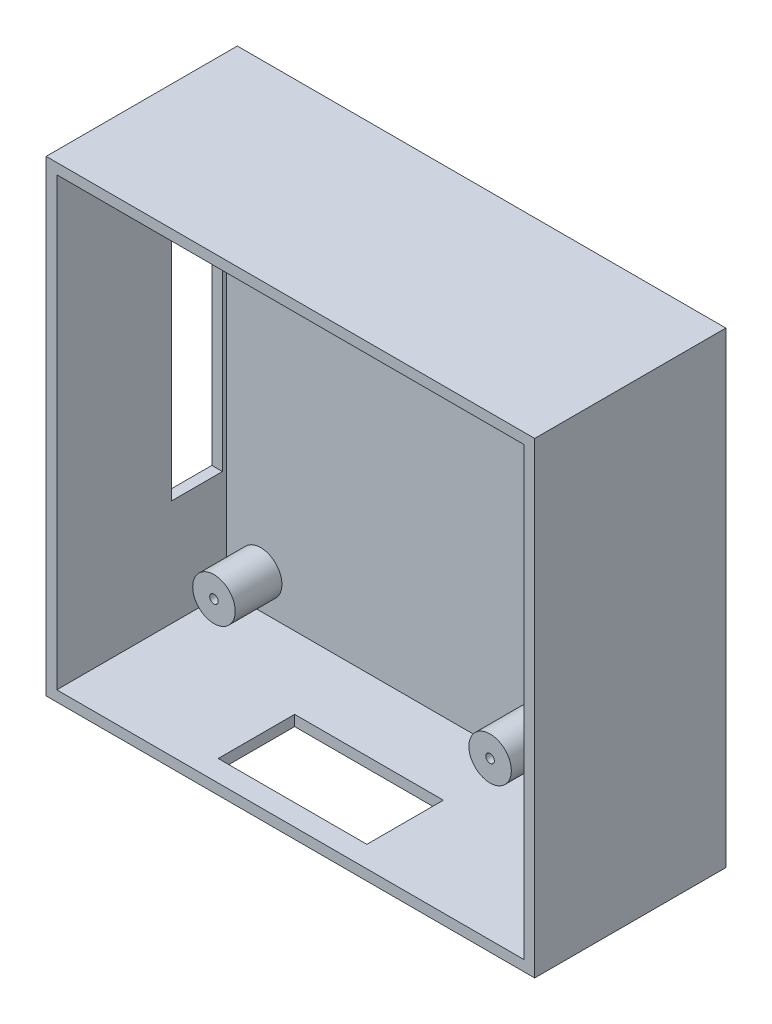
ISO-10303-21;
HEADER;
FILE_DESCRIPTION(('STEP AP214'),'2;1');
FILE_NAME('part.step','',(''),(''),'','','');
FILE_SCHEMA(('AUTOMOTIVE_DESIGN { 1 0 10303 214 1 1 1 1 }'));
ENDSEC;
DATA;
#1=APPLICATION_CONTEXT('core data for automotive mechanical design processes');
#2=APPLICATION_PROTOCOL_DEFINITION('international standard','automotive_design',2000,#1);
#3=PRODUCT_CONTEXT('',#1,'mechanical');
#4=PRODUCT('Part','Part','',(#3));
#5=PRODUCT_RELATED_PRODUCT_CATEGORY('part','',(#4));
#6=PRODUCT_DEFINITION_FORMATION('','',#4);
#7=PRODUCT_DEFINITION_CONTEXT('part definition',#1,'design');
#8=PRODUCT_DEFINITION('design','',#6,#7);
#9=PRODUCT_DEFINITION_SHAPE('','',#8);
#10=(LENGTH_UNIT() NAMED_UNIT(*) SI_UNIT(.MILLI.,.METRE.));
#11=(NAMED_UNIT(*) PLANE_ANGLE_UNIT() SI_UNIT($,.RADIAN.));
#12=(NAMED_UNIT(*) SI_UNIT($,.STERADIAN.) SOLID_ANGLE_UNIT());
#13=UNCERTAINTY_MEASURE_WITH_UNIT(LENGTH_MEASURE(1.E-05),#10,'distance_accuracy_value','');
#14=(GEOMETRIC_REPRESENTATION_CONTEXT(3) GLOBAL_UNCERTAINTY_ASSIGNED_CONTEXT((#13)) GLOBAL_UNIT_ASSIGNED_CONTEXT((#10,
#11,#12)) REPRESENTATION_CONTEXT('',''));
#15=CARTESIAN_POINT('',(0.,0.,0.));
#16=DIRECTION('',(0.,0.,1.));
#17=DIRECTION('',(1.,0.,0.));
#18=AXIS2_PLACEMENT_3D('',#15,#16,#17);
#19=CARTESIAN_POINT('',(57.5,55.,45.));
#20=DIRECTION('',(-1.,0.,0.));
#21=DIRECTION('',(0.,-1.,0.));
#22=AXIS2_PLACEMENT_3D('',#19,#20,#21);
#23=PLANE('',#22);
#24=DIRECTION('',(0.,1.,0.));
#25=VECTOR('',#24,1.);
#26=CARTESIAN_POINT('',(57.5,55.,0.));
#27=LINE('',#26,#25);
#28=CARTESIAN_POINT('',(57.5,-55.,0.));
#29=VERTEX_POINT('',#28);
#30=CARTESIAN_POINT('',(57.5,55.,0.));
#31=VERTEX_POINT('',#30);
#32=EDGE_CURVE('E315',#29,#31,#27,.T.);
#33=ORIENTED_EDGE('',*,*,#32,.T.);
#34=DIRECTION('',(0.,0.,-1.));
#35=VECTOR('',#34,1.);
#36=CARTESIAN_POINT('',(57.5,55.,45.));
#37=LINE('',#36,#35);
#38=CARTESIAN_POINT('',(57.5,55.,45.));
#39=VERTEX_POINT('',#38);
#40=EDGE_CURVE('E362',#39,#31,#37,.T.);
#41=ORIENTED_EDGE('',*,*,#40,.F.);
#42=DIRECTION('',(0.,1.,0.));
#43=VECTOR('',#42,1.);
#44=CARTESIAN_POINT('',(57.5,55.,45.));
#45=LINE('',#44,#43);
#46=CARTESIAN_POINT('',(57.5,-55.,45.));
#47=VERTEX_POINT('',#46);
#48=EDGE_CURVE('E325',#47,#39,#45,.T.);
#49=ORIENTED_EDGE('',*,*,#48,.F.);
#50=DIRECTION('',(0.,0.,-1.));
#51=VECTOR('',#50,1.);
#52=CARTESIAN_POINT('',(57.5,-55.,45.));
#53=LINE('',#52,#51);
#54=EDGE_CURVE('E339',#47,#29,#53,.T.);
#55=ORIENTED_EDGE('',*,*,#54,.T.);
#56=EDGE_LOOP('',(#33,#41,#49,#55));
#57=FACE_BOUND('',#56,.T.);
#58=ADVANCED_FACE('F41',(#57),#23,.F.);
#59=CARTESIAN_POINT('',(-57.5,55.,45.));
#60=DIRECTION('',(0.,-1.,0.));
#61=DIRECTION('',(0.,0.,-1.));
#62=AXIS2_PLACEMENT_3D('',#59,#60,#61);
#63=PLANE('',#62);
#64=DIRECTION('',(-1.,0.,0.));
#65=VECTOR('',#64,1.);
#66=CARTESIAN_POINT('',(-57.5,55.,0.));
#67=LINE('',#66,#65);
#68=CARTESIAN_POINT('',(-57.5,55.,0.));
#69=VERTEX_POINT('',#68);
#70=EDGE_CURVE('E343',#31,#69,#67,.T.);
#71=ORIENTED_EDGE('',*,*,#70,.T.);
#72=DIRECTION('',(0.,0.,-1.));
#73=VECTOR('',#72,1.);
#74=CARTESIAN_POINT('',(-57.5,55.,45.));
#75=LINE('',#74,#73);
#76=CARTESIAN_POINT('',(-57.5,55.,45.));
#77=VERTEX_POINT('',#76);
#78=EDGE_CURVE('E358',#77,#69,#75,.T.);
#79=ORIENTED_EDGE('',*,*,#78,.F.);
#80=DIRECTION('',(-1.,0.,0.));
#81=VECTOR('',#80,1.);
#82=CARTESIAN_POINT('',(-57.5,55.,45.));
#83=LINE('',#82,#81);
#84=EDGE_CURVE('E329',#39,#77,#83,.T.);
#85=ORIENTED_EDGE('',*,*,#84,.F.);
#86=ORIENTED_EDGE('',*,*,#40,.T.);
#87=EDGE_LOOP('',(#71,#79,#85,#86));
#88=FACE_BOUND('',#87,.T.);
#89=ADVANCED_FACE('F408',(#88),#63,.F.);
#90=CARTESIAN_POINT('',(-57.5,55.,45.));
#91=DIRECTION('',(1.,0.,0.));
#92=DIRECTION('',(0.,1.,0.));
#93=AXIS2_PLACEMENT_3D('',#90,#91,#92);
#94=PLANE('',#93);
#95=DIRECTION('',(0.,0.,1.));
#96=VECTOR('',#95,1.);
#97=CARTESIAN_POINT('',(-57.5,-27.5,6.00000000000001));
#98=LINE('',#97,#96);
#99=CARTESIAN_POINT('',(-57.5,-27.5,6.00000000000001));
#100=VERTEX_POINT('',#99);
#101=CARTESIAN_POINT('',(-57.5,-27.5,18.));
#102=VERTEX_POINT('',#101);
#103=EDGE_CURVE('E167',#100,#102,#98,.T.);
#104=ORIENTED_EDGE('',*,*,#103,.F.);
#105=DIRECTION('',(0.,-1.,0.));
#106=VECTOR('',#105,1.);
#107=CARTESIAN_POINT('',(-57.5,32.5,6.));
#108=LINE('',#107,#106);
#109=CARTESIAN_POINT('',(-57.5,32.5,6.));
#110=VERTEX_POINT('',#109);
#111=EDGE_CURVE('E56',#110,#100,#108,.T.);
#112=ORIENTED_EDGE('',*,*,#111,.F.);
#113=DIRECTION('',(0.,0.,-1.));
#114=VECTOR('',#113,1.);
#115=CARTESIAN_POINT('',(-57.5,32.5,6.));
#116=LINE('',#115,#114);
#117=CARTESIAN_POINT('',(-57.5,32.5,18.));
#118=VERTEX_POINT('',#117);
#119=EDGE_CURVE('E175',#118,#110,#116,.T.);
#120=ORIENTED_EDGE('',*,*,#119,.F.);
#121=DIRECTION('',(0.,1.,0.));
#122=VECTOR('',#121,1.);
#123=CARTESIAN_POINT('',(-57.5,32.5,18.));
#124=LINE('',#123,#122);
#125=EDGE_CURVE('E157',#102,#118,#124,.T.);
#126=ORIENTED_EDGE('',*,*,#125,.F.);
#127=EDGE_LOOP('',(#104,#112,#120,#126));
#128=FACE_BOUND('',#127,.T.);
#129=DIRECTION('',(0.,-1.,0.));
#130=VECTOR('',#129,1.);
#131=CARTESIAN_POINT('',(-57.5,55.,0.));
#132=LINE('',#131,#130);
#133=CARTESIAN_POINT('',(-57.5,-55.,0.));
#134=VERTEX_POINT('',#133);
#135=EDGE_CURVE('E346',#69,#134,#132,.T.);
#136=ORIENTED_EDGE('',*,*,#135,.T.);
#137=DIRECTION('',(0.,0.,-1.));
#138=VECTOR('',#137,1.);
#139=CARTESIAN_POINT('',(-57.5,-55.,45.));
#140=LINE('',#139,#138);
#141=CARTESIAN_POINT('',(-57.5,-55.,45.));
#142=VERTEX_POINT('',#141);
#143=EDGE_CURVE('E354',#142,#134,#140,.T.);
#144=ORIENTED_EDGE('',*,*,#143,.F.);
#145=DIRECTION('',(0.,-1.,0.));
#146=VECTOR('',#145,1.);
#147=CARTESIAN_POINT('',(-57.5,55.,45.));
#148=LINE('',#147,#146);
#149=EDGE_CURVE('E333',#77,#142,#148,.T.);
#150=ORIENTED_EDGE('',*,*,#149,.F.);
#151=ORIENTED_EDGE('',*,*,#78,.T.);
#152=EDGE_LOOP('',(#136,#144,#150,#151));
#153=FACE_BOUND('',#152,.T.);
#154=ADVANCED_FACE('F172',(#128,#153),#94,.F.);
#155=CARTESIAN_POINT('',(-57.5,-55.,45.));
#156=DIRECTION('',(0.,1.,0.));
#157=DIRECTION('',(0.,0.,1.));
#158=AXIS2_PLACEMENT_3D('',#155,#156,#157);
#159=PLANE('',#158);
#160=DIRECTION('',(0.,0.,1.));
#161=VECTOR('',#160,1.);
#162=CARTESIAN_POINT('',(13.,-55.,40.));
#163=LINE('',#162,#161);
#164=CARTESIAN_POINT('',(13.,-55.,22.));
#165=VERTEX_POINT('',#164);
#166=CARTESIAN_POINT('',(13.,-55.,40.));
#167=VERTEX_POINT('',#166);
#168=EDGE_CURVE('E197',#165,#167,#163,.T.);
#169=ORIENTED_EDGE('',*,*,#168,.F.);
#170=DIRECTION('',(1.,0.,0.));
#171=VECTOR('',#170,1.);
#172=CARTESIAN_POINT('',(-22.,-55.,22.));
#173=LINE('',#172,#171);
#174=CARTESIAN_POINT('',(-22.,-55.,22.));
#175=VERTEX_POINT('',#174);
#176=EDGE_CURVE('E201',#175,#165,#173,.T.);
#177=ORIENTED_EDGE('',*,*,#176,.F.);
#178=DIRECTION('',(0.,0.,-1.));
#179=VECTOR('',#178,1.);
#180=CARTESIAN_POINT('',(-22.,-55.,40.));
#181=LINE('',#180,#179);
#182=CARTESIAN_POINT('',(-22.,-55.,40.));
#183=VERTEX_POINT('',#182);
#184=EDGE_CURVE('E205',#183,#175,#181,.T.);
#185=ORIENTED_EDGE('',*,*,#184,.F.);
#186=DIRECTION('',(-1.,0.,0.));
#187=VECTOR('',#186,1.);
#188=CARTESIAN_POINT('',(-22.,-55.,40.));
#189=LINE('',#188,#187);
#190=EDGE_CURVE('E193',#167,#183,#189,.T.);
#191=ORIENTED_EDGE('',*,*,#190,.F.);
#192=EDGE_LOOP('',(#169,#177,#185,#191));
#193=FACE_BOUND('',#192,.T.);
#194=DIRECTION('',(1.,0.,0.));
#195=VECTOR('',#194,1.);
#196=CARTESIAN_POINT('',(-57.5,-55.,0.));
#197=LINE('',#196,#195);
#198=EDGE_CURVE('E330',#134,#29,#197,.T.);
#199=ORIENTED_EDGE('',*,*,#198,.T.);
#200=ORIENTED_EDGE('',*,*,#54,.F.);
#201=DIRECTION('',(1.,0.,0.));
#202=VECTOR('',#201,1.);
#203=CARTESIAN_POINT('',(-57.5,-55.,45.));
#204=LINE('',#203,#202);
#205=EDGE_CURVE('E336',#142,#47,#204,.T.);
#206=ORIENTED_EDGE('',*,*,#205,.F.);
#207=ORIENTED_EDGE('',*,*,#143,.T.);
#208=EDGE_LOOP('',(#199,#200,#206,#207));
#209=FACE_BOUND('',#208,.T.);
#210=ADVANCED_FACE('F429',(#193,#209),#159,.F.);
#211=CARTESIAN_POINT('',(0.,0.,45.));
#212=DIRECTION('',(0.,0.,1.));
#213=DIRECTION('',(1.,0.,0.));
#214=AXIS2_PLACEMENT_3D('',#211,#212,#213);
#215=PLANE('',#214);
#216=DIRECTION('',(0.,-1.,0.));
#217=VECTOR('',#216,1.);
#218=CARTESIAN_POINT('',(-55.,52.5,45.));
#219=LINE('',#218,#217);
#220=CARTESIAN_POINT('',(-55.,52.5,45.));
#221=VERTEX_POINT('',#220);
#222=CARTESIAN_POINT('',(-55.,-52.5,45.));
#223=VERTEX_POINT('',#222);
#224=EDGE_CURVE('E280',#221,#223,#219,.T.);
#225=ORIENTED_EDGE('',*,*,#224,.F.);
#226=DIRECTION('',(-1.,0.,0.));
#227=VECTOR('',#226,1.);
#228=CARTESIAN_POINT('',(55.,52.5,45.));
#229=LINE('',#228,#227);
#230=CARTESIAN_POINT('',(55.,52.5,45.));
#231=VERTEX_POINT('',#230);
#232=EDGE_CURVE('E286',#231,#221,#229,.T.);
#233=ORIENTED_EDGE('',*,*,#232,.F.);
#234=DIRECTION('',(0.,1.,0.));
#235=VECTOR('',#234,1.);
#236=CARTESIAN_POINT('',(55.,52.5,45.));
#237=LINE('',#236,#235);
#238=CARTESIAN_POINT('',(55.,-52.5,45.));
#239=VERTEX_POINT('',#238);
#240=EDGE_CURVE('E305',#239,#231,#237,.T.);
#241=ORIENTED_EDGE('',*,*,#240,.F.);
#242=DIRECTION('',(1.,0.,0.));
#243=VECTOR('',#242,1.);
#244=CARTESIAN_POINT('',(55.,-52.5,45.));
#245=LINE('',#244,#243);
#246=EDGE_CURVE('E301',#223,#239,#245,.T.);
#247=ORIENTED_EDGE('',*,*,#246,.F.);
#248=EDGE_LOOP('',(#225,#233,#241,#247));
#249=FACE_BOUND('',#248,.T.);
#250=ORIENTED_EDGE('',*,*,#48,.T.);
#251=ORIENTED_EDGE('',*,*,#84,.T.);
#252=ORIENTED_EDGE('',*,*,#149,.T.);
#253=ORIENTED_EDGE('',*,*,#205,.T.);
#254=EDGE_LOOP('',(#250,#251,#252,#253));
#255=FACE_BOUND('',#254,.T.);
#256=ADVANCED_FACE('F425',(#249,#255),#215,.T.);
#257=CARTESIAN_POINT('',(0.,0.,0.));
#258=DIRECTION('',(0.,0.,1.));
#259=DIRECTION('',(1.,0.,0.));
#260=AXIS2_PLACEMENT_3D('',#257,#258,#259);
#261=PLANE('',#260);
#262=CARTESIAN_POINT('',(-47.,-44.5,0.));
#263=DIRECTION('',(0.,0.,1.));
#264=DIRECTION('',(1.,0.,0.));
#265=AXIS2_PLACEMENT_3D('',#262,#263,#264);
#266=CIRCLE('',#265,0.999999999999998);
#267=CARTESIAN_POINT('',(-46.,-44.5,0.));
#268=VERTEX_POINT('',#267);
#269=EDGE_CURVE('E250',#268,#268,#266,.T.);
#270=ORIENTED_EDGE('',*,*,#269,.T.);
#271=EDGE_LOOP('',(#270));
#272=FACE_BOUND('',#271,.T.);
#273=CARTESIAN_POINT('',(18.,-44.5,0.));
#274=DIRECTION('',(0.,0.,1.));
#275=DIRECTION('',(1.,0.,0.));
#276=AXIS2_PLACEMENT_3D('',#273,#274,#275);
#277=CIRCLE('',#276,1.);
#278=CARTESIAN_POINT('',(19.,-44.5,0.));
#279=VERTEX_POINT('',#278);
#280=EDGE_CURVE('E242',#279,#279,#277,.T.);
#281=ORIENTED_EDGE('',*,*,#280,.T.);
#282=EDGE_LOOP('',(#281));
#283=FACE_BOUND('',#282,.T.);
#284=CARTESIAN_POINT('',(18.,44.5,0.));
#285=DIRECTION('',(0.,0.,1.));
#286=DIRECTION('',(1.,0.,0.));
#287=AXIS2_PLACEMENT_3D('',#284,#285,#286);
#288=CIRCLE('',#287,1.);
#289=CARTESIAN_POINT('',(19.,44.5,0.));
#290=VERTEX_POINT('',#289);
#291=EDGE_CURVE('E233',#290,#290,#288,.T.);
#292=ORIENTED_EDGE('',*,*,#291,.T.);
#293=EDGE_LOOP('',(#292));
#294=FACE_BOUND('',#293,.T.);
#295=CARTESIAN_POINT('',(-47.,44.5,0.));
#296=DIRECTION('',(0.,0.,1.));
#297=DIRECTION('',(1.,0.,0.));
#298=AXIS2_PLACEMENT_3D('',#295,#296,#297);
#299=CIRCLE('',#298,0.999999999999998);
#300=CARTESIAN_POINT('',(-46.,44.5,0.));
#301=VERTEX_POINT('',#300);
#302=EDGE_CURVE('E257',#301,#301,#299,.T.);
#303=ORIENTED_EDGE('',*,*,#302,.T.);
#304=EDGE_LOOP('',(#303));
#305=FACE_BOUND('',#304,.T.);
#306=ORIENTED_EDGE('',*,*,#32,.F.);
#307=ORIENTED_EDGE('',*,*,#198,.F.);
#308=ORIENTED_EDGE('',*,*,#135,.F.);
#309=ORIENTED_EDGE('',*,*,#70,.F.);
#310=EDGE_LOOP('',(#306,#307,#308,#309));
#311=FACE_BOUND('',#310,.T.);
#312=ADVANCED_FACE('F420',(#272,#283,#294,#305,#311),#261,.F.);
#313=CARTESIAN_POINT('',(-55.,52.5,5.));
#314=DIRECTION('',(-1.,0.,0.));
#315=DIRECTION('',(0.,-1.,0.));
#316=AXIS2_PLACEMENT_3D('',#313,#314,#315);
#317=PLANE('',#316);
#318=DIRECTION('',(0.,0.,-1.));
#319=VECTOR('',#318,1.);
#320=CARTESIAN_POINT('',(-55.,32.5,5.));
#321=LINE('',#320,#319);
#322=CARTESIAN_POINT('',(-55.,32.5,18.));
#323=VERTEX_POINT('',#322);
#324=CARTESIAN_POINT('',(-55.,32.5,6.));
#325=VERTEX_POINT('',#324);
#326=EDGE_CURVE('E49',#323,#325,#321,.T.);
#327=ORIENTED_EDGE('',*,*,#326,.T.);
#328=DIRECTION('',(0.,-1.,0.));
#329=VECTOR('',#328,1.);
#330=CARTESIAN_POINT('',(-55.,52.5,6.));
#331=LINE('',#330,#329);
#332=CARTESIAN_POINT('',(-55.,-27.5,6.00000000000001));
#333=VERTEX_POINT('',#332);
#334=EDGE_CURVE('E11',#325,#333,#331,.T.);
#335=ORIENTED_EDGE('',*,*,#334,.T.);
#336=DIRECTION('',(0.,0.,1.));
#337=VECTOR('',#336,1.);
#338=CARTESIAN_POINT('',(-55.,-27.5,5.));
#339=LINE('',#338,#337);
#340=CARTESIAN_POINT('',(-55.,-27.5,18.));
#341=VERTEX_POINT('',#340);
#342=EDGE_CURVE('E382',#333,#341,#339,.T.);
#343=ORIENTED_EDGE('',*,*,#342,.T.);
#344=DIRECTION('',(0.,1.,0.));
#345=VECTOR('',#344,1.);
#346=CARTESIAN_POINT('',(-55.,52.5,18.));
#347=LINE('',#346,#345);
#348=EDGE_CURVE('E160',#341,#323,#347,.T.);
#349=ORIENTED_EDGE('',*,*,#348,.T.);
#350=EDGE_LOOP('',(#327,#335,#343,#349));
#351=FACE_BOUND('',#350,.T.);
#352=ORIENTED_EDGE('',*,*,#224,.T.);
#353=DIRECTION('',(0.,0.,1.));
#354=VECTOR('',#353,1.);
#355=CARTESIAN_POINT('',(-55.,-52.5,5.));
#356=LINE('',#355,#354);
#357=CARTESIAN_POINT('',(-55.,-52.5,5.));
#358=VERTEX_POINT('',#357);
#359=EDGE_CURVE('E298',#358,#223,#356,.T.);
#360=ORIENTED_EDGE('',*,*,#359,.F.);
#361=DIRECTION('',(0.,-1.,0.));
#362=VECTOR('',#361,1.);
#363=CARTESIAN_POINT('',(-55.,52.5,5.));
#364=LINE('',#363,#362);
#365=CARTESIAN_POINT('',(-55.,52.5,5.));
#366=VERTEX_POINT('',#365);
#367=EDGE_CURVE('E281',#366,#358,#364,.T.);
#368=ORIENTED_EDGE('',*,*,#367,.F.);
#369=DIRECTION('',(0.,0.,1.));
#370=VECTOR('',#369,1.);
#371=CARTESIAN_POINT('',(-55.,52.5,5.));
#372=LINE('',#371,#370);
#373=EDGE_CURVE('E312',#366,#221,#372,.T.);
#374=ORIENTED_EDGE('',*,*,#373,.T.);
#375=EDGE_LOOP('',(#352,#360,#368,#374));
#376=FACE_BOUND('',#375,.T.);
#377=ADVANCED_FACE('F389',(#351,#376),#317,.F.);
#378=CARTESIAN_POINT('',(55.,52.5,5.));
#379=DIRECTION('',(0.,1.,0.));
#380=DIRECTION('',(-1.,0.,0.));
#381=AXIS2_PLACEMENT_3D('',#378,#379,#380);
#382=PLANE('',#381);
#383=ORIENTED_EDGE('',*,*,#232,.T.);
#384=ORIENTED_EDGE('',*,*,#373,.F.);
#385=DIRECTION('',(-1.,0.,0.));
#386=VECTOR('',#385,1.);
#387=CARTESIAN_POINT('',(55.,52.5,5.));
#388=LINE('',#387,#386);
#389=CARTESIAN_POINT('',(55.,52.5,5.));
#390=VERTEX_POINT('',#389);
#391=EDGE_CURVE('E294',#390,#366,#388,.T.);
#392=ORIENTED_EDGE('',*,*,#391,.F.);
#393=DIRECTION('',(0.,0.,1.));
#394=VECTOR('',#393,1.);
#395=CARTESIAN_POINT('',(55.,52.5,5.));
#396=LINE('',#395,#394);
#397=EDGE_CURVE('E316',#390,#231,#396,.T.);
#398=ORIENTED_EDGE('',*,*,#397,.T.);
#399=EDGE_LOOP('',(#383,#384,#392,#398));
#400=FACE_BOUND('',#399,.T.);
#401=ADVANCED_FACE('F446',(#400),#382,.F.);
#402=CARTESIAN_POINT('',(55.,52.5,5.));
#403=DIRECTION('',(1.,0.,0.));
#404=DIRECTION('',(0.,1.,0.));
#405=AXIS2_PLACEMENT_3D('',#402,#403,#404);
#406=PLANE('',#405);
#407=ORIENTED_EDGE('',*,*,#240,.T.);
#408=ORIENTED_EDGE('',*,*,#397,.F.);
#409=DIRECTION('',(0.,1.,0.));
#410=VECTOR('',#409,1.);
#411=CARTESIAN_POINT('',(55.,52.5,5.));
#412=LINE('',#411,#410);
#413=CARTESIAN_POINT('',(55.,-52.5,5.));
#414=VERTEX_POINT('',#413);
#415=EDGE_CURVE('E290',#414,#390,#412,.T.);
#416=ORIENTED_EDGE('',*,*,#415,.F.);
#417=DIRECTION('',(0.,0.,1.));
#418=VECTOR('',#417,1.);
#419=CARTESIAN_POINT('',(55.,-52.5,5.));
#420=LINE('',#419,#418);
#421=EDGE_CURVE('E319',#414,#239,#420,.T.);
#422=ORIENTED_EDGE('',*,*,#421,.T.);
#423=EDGE_LOOP('',(#407,#408,#416,#422));
#424=FACE_BOUND('',#423,.T.);
#425=ADVANCED_FACE('F451',(#424),#406,.F.);
#426=CARTESIAN_POINT('',(55.,-52.5,5.));
#427=DIRECTION('',(0.,-1.,0.));
#428=DIRECTION('',(1.,0.,0.));
#429=AXIS2_PLACEMENT_3D('',#426,#427,#428);
#430=PLANE('',#429);
#431=DIRECTION('',(0.,0.,1.));
#432=VECTOR('',#431,1.);
#433=CARTESIAN_POINT('',(-22.,-52.5,40.));
#434=LINE('',#433,#432);
#435=CARTESIAN_POINT('',(-22.,-52.5,22.));
#436=VERTEX_POINT('',#435);
#437=CARTESIAN_POINT('',(-22.,-52.5,40.));
#438=VERTEX_POINT('',#437);
#439=EDGE_CURVE('E192',#436,#438,#434,.T.);
#440=ORIENTED_EDGE('',*,*,#439,.F.);
#441=DIRECTION('',(-1.,0.,0.));
#442=VECTOR('',#441,1.);
#443=CARTESIAN_POINT('',(-22.,-52.5,22.));
#444=LINE('',#443,#442);
#445=CARTESIAN_POINT('',(13.,-52.5,22.));
#446=VERTEX_POINT('',#445);
#447=EDGE_CURVE('E185',#446,#436,#444,.T.);
#448=ORIENTED_EDGE('',*,*,#447,.F.);
#449=DIRECTION('',(0.,0.,-1.));
#450=VECTOR('',#449,1.);
#451=CARTESIAN_POINT('',(13.,-52.5,40.));
#452=LINE('',#451,#450);
#453=CARTESIAN_POINT('',(13.,-52.5,40.));
#454=VERTEX_POINT('',#453);
#455=EDGE_CURVE('E209',#454,#446,#452,.T.);
#456=ORIENTED_EDGE('',*,*,#455,.F.);
#457=DIRECTION('',(1.,0.,0.));
#458=VECTOR('',#457,1.);
#459=CARTESIAN_POINT('',(-22.,-52.5,40.));
#460=LINE('',#459,#458);
#461=EDGE_CURVE('E213',#438,#454,#460,.T.);
#462=ORIENTED_EDGE('',*,*,#461,.F.);
#463=EDGE_LOOP('',(#440,#448,#456,#462));
#464=FACE_BOUND('',#463,.T.);
#465=ORIENTED_EDGE('',*,*,#246,.T.);
#466=ORIENTED_EDGE('',*,*,#421,.F.);
#467=DIRECTION('',(1.,0.,0.));
#468=VECTOR('',#467,1.);
#469=CARTESIAN_POINT('',(55.,-52.5,5.));
#470=LINE('',#469,#468);
#471=EDGE_CURVE('E285',#358,#414,#470,.T.);
#472=ORIENTED_EDGE('',*,*,#471,.F.);
#473=ORIENTED_EDGE('',*,*,#359,.T.);
#474=EDGE_LOOP('',(#465,#466,#472,#473));
#475=FACE_BOUND('',#474,.T.);
#476=ADVANCED_FACE('F447',(#464,#475),#430,.F.);
#477=CARTESIAN_POINT('',(0.,0.,5.));
#478=DIRECTION('',(0.,0.,-1.));
#479=DIRECTION('',(-1.,0.,0.));
#480=AXIS2_PLACEMENT_3D('',#477,#478,#479);
#481=PLANE('',#480);
#482=CARTESIAN_POINT('',(-47.,-44.5,5.));
#483=DIRECTION('',(0.,0.,-1.));
#484=DIRECTION('',(-1.,0.,0.));
#485=AXIS2_PLACEMENT_3D('',#482,#483,#484);
#486=CIRCLE('',#485,5.);
#487=CARTESIAN_POINT('',(-52.,-44.5,5.));
#488=VERTEX_POINT('',#487);
#489=EDGE_CURVE('E378',#488,#488,#486,.F.);
#490=ORIENTED_EDGE('',*,*,#489,.F.);
#491=EDGE_LOOP('',(#490));
#492=FACE_BOUND('',#491,.T.);
#493=CARTESIAN_POINT('',(18.,-44.5,5.));
#494=DIRECTION('',(0.,0.,-1.));
#495=DIRECTION('',(-1.,0.,0.));
#496=AXIS2_PLACEMENT_3D('',#493,#494,#495);
#497=CIRCLE('',#496,5.);
#498=CARTESIAN_POINT('',(13.,-44.5,5.));
#499=VERTEX_POINT('',#498);
#500=EDGE_CURVE('E374',#499,#499,#497,.F.);
#501=ORIENTED_EDGE('',*,*,#500,.F.);
#502=EDGE_LOOP('',(#501));
#503=FACE_BOUND('',#502,.T.);
#504=CARTESIAN_POINT('',(18.,44.5,5.));
#505=DIRECTION('',(0.,0.,-1.));
#506=DIRECTION('',(-1.,0.,0.));
#507=AXIS2_PLACEMENT_3D('',#504,#505,#506);
#508=CIRCLE('',#507,5.);
#509=CARTESIAN_POINT('',(13.,44.5,5.));
#510=VERTEX_POINT('',#509);
#511=EDGE_CURVE('E370',#510,#510,#508,.F.);
#512=ORIENTED_EDGE('',*,*,#511,.F.);
#513=EDGE_LOOP('',(#512));
#514=FACE_BOUND('',#513,.T.);
#515=CARTESIAN_POINT('',(-47.,44.5,5.));
#516=DIRECTION('',(0.,0.,-1.));
#517=DIRECTION('',(-1.,0.,0.));
#518=AXIS2_PLACEMENT_3D('',#515,#516,#517);
#519=CIRCLE('',#518,5.);
#520=CARTESIAN_POINT('',(-52.,44.5,5.));
#521=VERTEX_POINT('',#520);
#522=EDGE_CURVE('E366',#521,#521,#519,.F.);
#523=ORIENTED_EDGE('',*,*,#522,.F.);
#524=EDGE_LOOP('',(#523));
#525=FACE_BOUND('',#524,.T.);
#526=ORIENTED_EDGE('',*,*,#367,.T.);
#527=ORIENTED_EDGE('',*,*,#471,.T.);
#528=ORIENTED_EDGE('',*,*,#415,.T.);
#529=ORIENTED_EDGE('',*,*,#391,.T.);
#530=EDGE_LOOP('',(#526,#527,#528,#529));
#531=FACE_BOUND('',#530,.T.);
#532=ADVANCED_FACE('F450',(#492,#503,#514,#525,#531),#481,.F.);
#533=CARTESIAN_POINT('',(-47.,44.5,16.));
#534=DIRECTION('',(0.,0.,-1.));
#535=DIRECTION('',(-1.,0.,0.));
#536=AXIS2_PLACEMENT_3D('',#533,#534,#535);
#537=CYLINDRICAL_SURFACE('',#536,5.);
#538=CARTESIAN_POINT('',(-47.,44.5,16.));
#539=DIRECTION('',(0.,0.,1.));
#540=DIRECTION('',(1.,0.,0.));
#541=AXIS2_PLACEMENT_3D('',#538,#539,#540);
#542=CIRCLE('',#541,5.);
#543=CARTESIAN_POINT('',(-42.,44.5,16.));
#544=VERTEX_POINT('',#543);
#545=EDGE_CURVE('E276',#544,#544,#542,.T.);
#546=ORIENTED_EDGE('',*,*,#545,.F.);
#547=EDGE_LOOP('',(#546));
#548=FACE_BOUND('',#547,.T.);
#549=ORIENTED_EDGE('',*,*,#522,.T.);
#550=EDGE_LOOP('',(#549));
#551=FACE_BOUND('',#550,.T.);
#552=ADVANCED_FACE('F461',(#548,#551),#537,.T.);
#553=CARTESIAN_POINT('',(-47.,44.5,16.));
#554=DIRECTION('',(0.,0.,1.));
#555=DIRECTION('',(1.,0.,0.));
#556=AXIS2_PLACEMENT_3D('',#553,#554,#555);
#557=PLANE('',#556);
#558=CARTESIAN_POINT('',(-47.,44.5,16.));
#559=DIRECTION('',(0.,0.,1.));
#560=DIRECTION('',(1.,0.,0.));
#561=AXIS2_PLACEMENT_3D('',#558,#559,#560);
#562=CIRCLE('',#561,0.999999999999998);
#563=CARTESIAN_POINT('',(-46.,44.5,16.));
#564=VERTEX_POINT('',#563);
#565=EDGE_CURVE('E237',#564,#564,#562,.T.);
#566=ORIENTED_EDGE('',*,*,#565,.F.);
#567=EDGE_LOOP('',(#566));
#568=FACE_BOUND('',#567,.T.);
#569=ORIENTED_EDGE('',*,*,#545,.T.);
#570=EDGE_LOOP('',(#569));
#571=FACE_BOUND('',#570,.T.);
#572=ADVANCED_FACE('F465',(#568,#571),#557,.T.);
#573=CARTESIAN_POINT('',(18.,44.5,16.));
#574=DIRECTION('',(0.,0.,-1.));
#575=DIRECTION('',(-1.,0.,0.));
#576=AXIS2_PLACEMENT_3D('',#573,#574,#575);
#577=CYLINDRICAL_SURFACE('',#576,5.);
#578=CARTESIAN_POINT('',(18.,44.5,16.));
#579=DIRECTION('',(0.,0.,1.));
#580=DIRECTION('',(1.,0.,0.));
#581=AXIS2_PLACEMENT_3D('',#578,#579,#580);
#582=CIRCLE('',#581,5.);
#583=CARTESIAN_POINT('',(23.,44.5,16.));
#584=VERTEX_POINT('',#583);
#585=EDGE_CURVE('E272',#584,#584,#582,.T.);
#586=ORIENTED_EDGE('',*,*,#585,.F.);
#587=EDGE_LOOP('',(#586));
#588=FACE_BOUND('',#587,.T.);
#589=ORIENTED_EDGE('',*,*,#511,.T.);
#590=EDGE_LOOP('',(#589));
#591=FACE_BOUND('',#590,.T.);
#592=ADVANCED_FACE('F469',(#588,#591),#577,.T.);
#593=CARTESIAN_POINT('',(18.,44.5,16.));
#594=DIRECTION('',(0.,0.,1.));
#595=DIRECTION('',(1.,0.,0.));
#596=AXIS2_PLACEMENT_3D('',#593,#594,#595);
#597=PLANE('',#596);
#598=CARTESIAN_POINT('',(18.,44.5,16.));
#599=DIRECTION('',(0.,0.,1.));
#600=DIRECTION('',(1.,0.,0.));
#601=AXIS2_PLACEMENT_3D('',#598,#599,#600);
#602=CIRCLE('',#601,1.);
#603=CARTESIAN_POINT('',(19.,44.5,16.));
#604=VERTEX_POINT('',#603);
#605=EDGE_CURVE('E238',#604,#604,#602,.T.);
#606=ORIENTED_EDGE('',*,*,#605,.F.);
#607=EDGE_LOOP('',(#606));
#608=FACE_BOUND('',#607,.T.);
#609=ORIENTED_EDGE('',*,*,#585,.T.);
#610=EDGE_LOOP('',(#609));
#611=FACE_BOUND('',#610,.T.);
#612=ADVANCED_FACE('F471',(#608,#611),#597,.T.);
#613=CARTESIAN_POINT('',(18.,-44.5,16.));
#614=DIRECTION('',(0.,0.,-1.));
#615=DIRECTION('',(-1.,0.,0.));
#616=AXIS2_PLACEMENT_3D('',#613,#614,#615);
#617=CYLINDRICAL_SURFACE('',#616,5.);
#618=CARTESIAN_POINT('',(18.,-44.5,16.));
#619=DIRECTION('',(0.,0.,1.));
#620=DIRECTION('',(1.,0.,0.));
#621=AXIS2_PLACEMENT_3D('',#618,#619,#620);
#622=CIRCLE('',#621,5.);
#623=CARTESIAN_POINT('',(23.,-44.5,16.));
#624=VERTEX_POINT('',#623);
#625=EDGE_CURVE('E268',#624,#624,#622,.T.);
#626=ORIENTED_EDGE('',*,*,#625,.F.);
#627=EDGE_LOOP('',(#626));
#628=FACE_BOUND('',#627,.T.);
#629=ORIENTED_EDGE('',*,*,#500,.T.);
#630=EDGE_LOOP('',(#629));
#631=FACE_BOUND('',#630,.T.);
#632=ADVANCED_FACE('F474',(#628,#631),#617,.T.);
#633=CARTESIAN_POINT('',(18.,-44.5,16.));
#634=DIRECTION('',(0.,0.,1.));
#635=DIRECTION('',(1.,0.,0.));
#636=AXIS2_PLACEMENT_3D('',#633,#634,#635);
#637=PLANE('',#636);
#638=CARTESIAN_POINT('',(18.,-44.5,16.));
#639=DIRECTION('',(0.,0.,1.));
#640=DIRECTION('',(1.,0.,0.));
#641=AXIS2_PLACEMENT_3D('',#638,#639,#640);
#642=CIRCLE('',#641,1.);
#643=CARTESIAN_POINT('',(19.,-44.5,16.));
#644=VERTEX_POINT('',#643);
#645=EDGE_CURVE('E246',#644,#644,#642,.T.);
#646=ORIENTED_EDGE('',*,*,#645,.F.);
#647=EDGE_LOOP('',(#646));
#648=FACE_BOUND('',#647,.T.);
#649=ORIENTED_EDGE('',*,*,#625,.T.);
#650=EDGE_LOOP('',(#649));
#651=FACE_BOUND('',#650,.T.);
#652=ADVANCED_FACE('F479',(#648,#651),#637,.T.);
#653=CARTESIAN_POINT('',(-47.,-44.5,16.));
#654=DIRECTION('',(0.,0.,-1.));
#655=DIRECTION('',(-1.,0.,0.));
#656=AXIS2_PLACEMENT_3D('',#653,#654,#655);
#657=CYLINDRICAL_SURFACE('',#656,5.);
#658=CARTESIAN_POINT('',(-47.,-44.5,16.));
#659=DIRECTION('',(0.,0.,1.));
#660=DIRECTION('',(1.,0.,0.));
#661=AXIS2_PLACEMENT_3D('',#658,#659,#660);
#662=CIRCLE('',#661,5.);
#663=CARTESIAN_POINT('',(-42.,-44.5,16.));
#664=VERTEX_POINT('',#663);
#665=EDGE_CURVE('E261',#664,#664,#662,.T.);
#666=ORIENTED_EDGE('',*,*,#665,.F.);
#667=EDGE_LOOP('',(#666));
#668=FACE_BOUND('',#667,.T.);
#669=ORIENTED_EDGE('',*,*,#489,.T.);
#670=EDGE_LOOP('',(#669));
#671=FACE_BOUND('',#670,.T.);
#672=ADVANCED_FACE('F482',(#668,#671),#657,.T.);
#673=CARTESIAN_POINT('',(-47.,-44.5,16.));
#674=DIRECTION('',(0.,0.,1.));
#675=DIRECTION('',(1.,0.,0.));
#676=AXIS2_PLACEMENT_3D('',#673,#674,#675);
#677=PLANE('',#676);
#678=CARTESIAN_POINT('',(-47.,-44.5,16.));
#679=DIRECTION('',(0.,0.,1.));
#680=DIRECTION('',(1.,0.,0.));
#681=AXIS2_PLACEMENT_3D('',#678,#679,#680);
#682=CIRCLE('',#681,0.999999999999998);
#683=CARTESIAN_POINT('',(-46.,-44.5,16.));
#684=VERTEX_POINT('',#683);
#685=EDGE_CURVE('E232',#684,#684,#682,.T.);
#686=ORIENTED_EDGE('',*,*,#685,.F.);
#687=EDGE_LOOP('',(#686));
#688=FACE_BOUND('',#687,.T.);
#689=ORIENTED_EDGE('',*,*,#665,.T.);
#690=EDGE_LOOP('',(#689));
#691=FACE_BOUND('',#690,.T.);
#692=ADVANCED_FACE('F487',(#688,#691),#677,.T.);
#693=CARTESIAN_POINT('',(-47.,-44.5,0.));
#694=DIRECTION('',(0.,0.,1.));
#695=DIRECTION('',(1.,0.,0.));
#696=AXIS2_PLACEMENT_3D('',#693,#694,#695);
#697=CYLINDRICAL_SURFACE('',#696,0.999999999999998);
#698=ORIENTED_EDGE('',*,*,#269,.F.);
#699=EDGE_LOOP('',(#698));
#700=FACE_BOUND('',#699,.T.);
#701=ORIENTED_EDGE('',*,*,#685,.T.);
#702=EDGE_LOOP('',(#701));
#703=FACE_BOUND('',#702,.T.);
#704=ADVANCED_FACE('F490',(#700,#703),#697,.F.);
#705=CARTESIAN_POINT('',(18.,-44.5,0.));
#706=DIRECTION('',(0.,0.,1.));
#707=DIRECTION('',(1.,0.,0.));
#708=AXIS2_PLACEMENT_3D('',#705,#706,#707);
#709=CYLINDRICAL_SURFACE('',#708,1.);
#710=ORIENTED_EDGE('',*,*,#280,.F.);
#711=EDGE_LOOP('',(#710));
#712=FACE_BOUND('',#711,.T.);
#713=ORIENTED_EDGE('',*,*,#645,.T.);
#714=EDGE_LOOP('',(#713));
#715=FACE_BOUND('',#714,.T.);
#716=ADVANCED_FACE('F503',(#712,#715),#709,.F.);
#717=CARTESIAN_POINT('',(18.,44.5,0.));
#718=DIRECTION('',(0.,0.,1.));
#719=DIRECTION('',(1.,0.,0.));
#720=AXIS2_PLACEMENT_3D('',#717,#718,#719);
#721=CYLINDRICAL_SURFACE('',#720,1.);
#722=ORIENTED_EDGE('',*,*,#291,.F.);
#723=EDGE_LOOP('',(#722));
#724=FACE_BOUND('',#723,.T.);
#725=ORIENTED_EDGE('',*,*,#605,.T.);
#726=EDGE_LOOP('',(#725));
#727=FACE_BOUND('',#726,.T.);
#728=ADVANCED_FACE('F499',(#724,#727),#721,.F.);
#729=CARTESIAN_POINT('',(-47.,44.5,0.));
#730=DIRECTION('',(0.,0.,1.));
#731=DIRECTION('',(1.,0.,0.));
#732=AXIS2_PLACEMENT_3D('',#729,#730,#731);
#733=CYLINDRICAL_SURFACE('',#732,0.999999999999998);
#734=ORIENTED_EDGE('',*,*,#302,.F.);
#735=EDGE_LOOP('',(#734));
#736=FACE_BOUND('',#735,.T.);
#737=ORIENTED_EDGE('',*,*,#565,.T.);
#738=EDGE_LOOP('',(#737));
#739=FACE_BOUND('',#738,.T.);
#740=ADVANCED_FACE('F495',(#736,#739),#733,.F.);
#741=CARTESIAN_POINT('',(-22.,55.001,22.));
#742=DIRECTION('',(0.,0.,-1.));
#743=DIRECTION('',(-1.,0.,0.));
#744=AXIS2_PLACEMENT_3D('',#741,#742,#743);
#745=PLANE('',#744);
#746=ORIENTED_EDGE('',*,*,#447,.T.);
#747=DIRECTION('',(0.,-1.,0.));
#748=VECTOR('',#747,1.);
#749=CARTESIAN_POINT('',(-22.,55.001,22.));
#750=LINE('',#749,#748);
#751=EDGE_CURVE('E224',#436,#175,#750,.T.);
#752=ORIENTED_EDGE('',*,*,#751,.T.);
#753=ORIENTED_EDGE('',*,*,#176,.T.);
#754=DIRECTION('',(0.,-1.,0.));
#755=VECTOR('',#754,1.);
#756=CARTESIAN_POINT('',(13.,55.001,22.));
#757=LINE('',#756,#755);
#758=EDGE_CURVE('E196',#446,#165,#757,.T.);
#759=ORIENTED_EDGE('',*,*,#758,.F.);
#760=EDGE_LOOP('',(#746,#752,#753,#759));
#761=FACE_BOUND('',#760,.T.);
#762=ADVANCED_FACE('F498',(#761),#745,.F.);
#763=CARTESIAN_POINT('',(13.,55.001,40.));
#764=DIRECTION('',(1.,0.,0.));
#765=DIRECTION('',(0.,0.,-1.));
#766=AXIS2_PLACEMENT_3D('',#763,#764,#765);
#767=PLANE('',#766);
#768=ORIENTED_EDGE('',*,*,#455,.T.);
#769=ORIENTED_EDGE('',*,*,#758,.T.);
#770=ORIENTED_EDGE('',*,*,#168,.T.);
#771=DIRECTION('',(0.,-1.,0.));
#772=VECTOR('',#771,1.);
#773=CARTESIAN_POINT('',(13.,55.001,40.));
#774=LINE('',#773,#772);
#775=EDGE_CURVE('E225',#454,#167,#774,.T.);
#776=ORIENTED_EDGE('',*,*,#775,.F.);
#777=EDGE_LOOP('',(#768,#769,#770,#776));
#778=FACE_BOUND('',#777,.T.);
#779=ADVANCED_FACE('F513',(#778),#767,.F.);
#780=CARTESIAN_POINT('',(-22.,55.001,40.));
#781=DIRECTION('',(0.,0.,1.));
#782=DIRECTION('',(1.,0.,0.));
#783=AXIS2_PLACEMENT_3D('',#780,#781,#782);
#784=PLANE('',#783);
#785=ORIENTED_EDGE('',*,*,#461,.T.);
#786=ORIENTED_EDGE('',*,*,#775,.T.);
#787=ORIENTED_EDGE('',*,*,#190,.T.);
#788=DIRECTION('',(0.,-1.,0.));
#789=VECTOR('',#788,1.);
#790=CARTESIAN_POINT('',(-22.,55.001,40.));
#791=LINE('',#790,#789);
#792=EDGE_CURVE('E220',#438,#183,#791,.T.);
#793=ORIENTED_EDGE('',*,*,#792,.F.);
#794=EDGE_LOOP('',(#785,#786,#787,#793));
#795=FACE_BOUND('',#794,.T.);
#796=ADVANCED_FACE('F403',(#795),#784,.F.);
#797=CARTESIAN_POINT('',(-22.,55.001,40.));
#798=DIRECTION('',(-1.,0.,0.));
#799=DIRECTION('',(0.,0.,1.));
#800=AXIS2_PLACEMENT_3D('',#797,#798,#799);
#801=PLANE('',#800);
#802=ORIENTED_EDGE('',*,*,#439,.T.);
#803=ORIENTED_EDGE('',*,*,#792,.T.);
#804=ORIENTED_EDGE('',*,*,#184,.T.);
#805=ORIENTED_EDGE('',*,*,#751,.F.);
#806=EDGE_LOOP('',(#802,#803,#804,#805));
#807=FACE_BOUND('',#806,.T.);
#808=ADVANCED_FACE('F396',(#807),#801,.F.);
#809=CARTESIAN_POINT('',(-52.5,32.5,6.));
#810=DIRECTION('',(0.,0.,-1.));
#811=DIRECTION('',(0.,1.,0.));
#812=AXIS2_PLACEMENT_3D('',#809,#810,#811);
#813=PLANE('',#812);
#814=DIRECTION('',(-1.,0.,0.));
#815=VECTOR('',#814,1.);
#816=CARTESIAN_POINT('',(-52.5,32.5,6.));
#817=LINE('',#816,#815);
#818=EDGE_CURVE('E182',#325,#110,#817,.T.);
#819=ORIENTED_EDGE('',*,*,#818,.T.);
#820=ORIENTED_EDGE('',*,*,#111,.T.);
#821=DIRECTION('',(-1.,0.,0.));
#822=VECTOR('',#821,1.);
#823=CARTESIAN_POINT('',(-52.5,-27.5,6.00000000000001));
#824=LINE('',#823,#822);
#825=EDGE_CURVE('E164',#333,#100,#824,.T.);
#826=ORIENTED_EDGE('',*,*,#825,.F.);
#827=ORIENTED_EDGE('',*,*,#334,.F.);
#828=EDGE_LOOP('',(#819,#820,#826,#827));
#829=FACE_BOUND('',#828,.T.);
#830=ADVANCED_FACE('F394',(#829),#813,.F.);
#831=CARTESIAN_POINT('',(-52.5,32.5,6.));
#832=DIRECTION('',(0.,1.,0.));
#833=DIRECTION('',(-1.,0.,0.));
#834=AXIS2_PLACEMENT_3D('',#831,#832,#833);
#835=PLANE('',#834);
#836=DIRECTION('',(-1.,0.,0.));
#837=VECTOR('',#836,1.);
#838=CARTESIAN_POINT('',(-52.5,32.5,18.));
#839=LINE('',#838,#837);
#840=EDGE_CURVE('E163',#323,#118,#839,.T.);
#841=ORIENTED_EDGE('',*,*,#840,.T.);
#842=ORIENTED_EDGE('',*,*,#119,.T.);
#843=ORIENTED_EDGE('',*,*,#818,.F.);
#844=ORIENTED_EDGE('',*,*,#326,.F.);
#845=EDGE_LOOP('',(#841,#842,#843,#844));
#846=FACE_BOUND('',#845,.T.);
#847=ADVANCED_FACE('F393',(#846),#835,.F.);
#848=CARTESIAN_POINT('',(-52.5,32.5,18.));
#849=DIRECTION('',(0.,0.,1.));
#850=DIRECTION('',(0.,-1.,0.));
#851=AXIS2_PLACEMENT_3D('',#848,#849,#850);
#852=PLANE('',#851);
#853=DIRECTION('',(-1.,0.,0.));
#854=VECTOR('',#853,1.);
#855=CARTESIAN_POINT('',(-52.5,-27.5,18.));
#856=LINE('',#855,#854);
#857=EDGE_CURVE('E64',#341,#102,#856,.T.);
#858=ORIENTED_EDGE('',*,*,#857,.T.);
#859=ORIENTED_EDGE('',*,*,#125,.T.);
#860=ORIENTED_EDGE('',*,*,#840,.F.);
#861=ORIENTED_EDGE('',*,*,#348,.F.);
#862=EDGE_LOOP('',(#858,#859,#860,#861));
#863=FACE_BOUND('',#862,.T.);
#864=ADVANCED_FACE('F154',(#863),#852,.F.);
#865=CARTESIAN_POINT('',(-52.5,-27.5,6.00000000000001));
#866=DIRECTION('',(0.,-1.,0.));
#867=DIRECTION('',(1.,0.,0.));
#868=AXIS2_PLACEMENT_3D('',#865,#866,#867);
#869=PLANE('',#868);
#870=ORIENTED_EDGE('',*,*,#825,.T.);
#871=ORIENTED_EDGE('',*,*,#103,.T.);
#872=ORIENTED_EDGE('',*,*,#857,.F.);
#873=ORIENTED_EDGE('',*,*,#342,.F.);
#874=EDGE_LOOP('',(#870,#871,#872,#873));
#875=FACE_BOUND('',#874,.T.);
#876=ADVANCED_FACE('F168',(#875),#869,.F.);
#877=CLOSED_SHELL('',(#58,#89,#154,#210,#256,#312,#377,#401,#425,#476,#532,#552,#572,#592,#612,
#632,#652,#672,#692,#704,#716,#728,#740,#762,#779,#796,#808,#830,#847,#864,#876));
#878=MANIFOLD_SOLID_BREP('B2',#877);
#879=ADVANCED_BREP_SHAPE_REPRESENTATION('',(#18,#878),#14);
#880=SHAPE_DEFINITION_REPRESENTATION(#9,#879);
ENDSEC;
END-ISO-10303-21;
